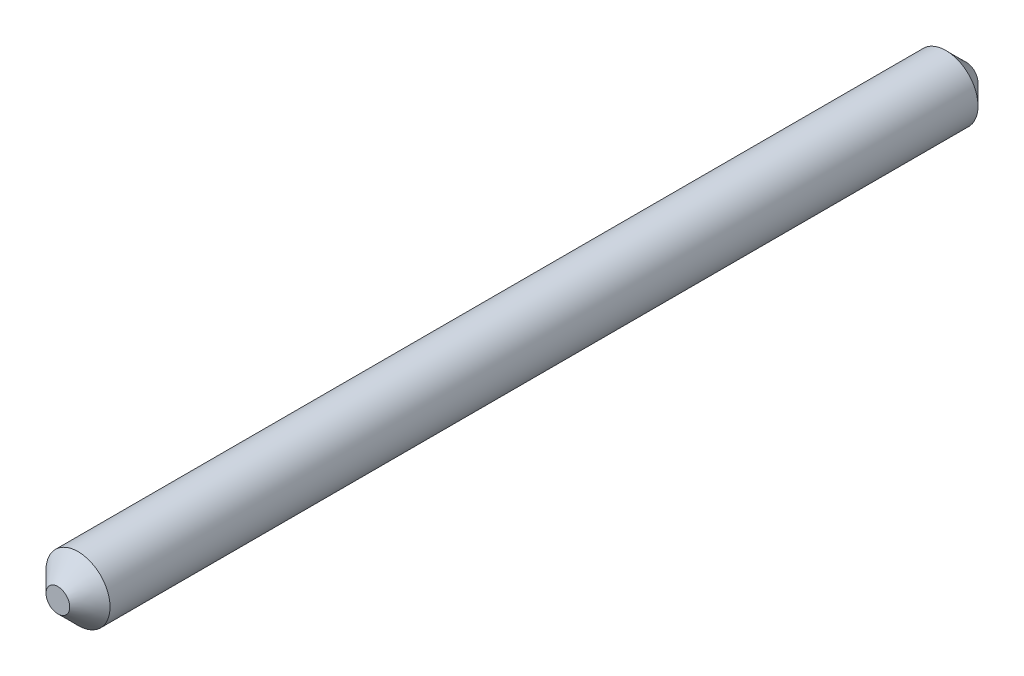
ISO-10303-21;
HEADER;
FILE_DESCRIPTION(('STEP AP214'),'2;1');
FILE_NAME('part.step','',(''),(''),'','','');
FILE_SCHEMA(('AUTOMOTIVE_DESIGN { 1 0 10303 214 1 1 1 1 }'));
ENDSEC;
DATA;
#1=APPLICATION_CONTEXT('core data for automotive mechanical design processes');
#2=APPLICATION_PROTOCOL_DEFINITION('international standard','automotive_design',2000,#1);
#3=PRODUCT_CONTEXT('',#1,'mechanical');
#4=PRODUCT('Part','Part','',(#3));
#5=PRODUCT_RELATED_PRODUCT_CATEGORY('part','',(#4));
#6=PRODUCT_DEFINITION_FORMATION('','',#4);
#7=PRODUCT_DEFINITION_CONTEXT('part definition',#1,'design');
#8=PRODUCT_DEFINITION('design','',#6,#7);
#9=PRODUCT_DEFINITION_SHAPE('','',#8);
#10=(LENGTH_UNIT() NAMED_UNIT(*) SI_UNIT(.MILLI.,.METRE.));
#11=(NAMED_UNIT(*) PLANE_ANGLE_UNIT() SI_UNIT($,.RADIAN.));
#12=(NAMED_UNIT(*) SI_UNIT($,.STERADIAN.) SOLID_ANGLE_UNIT());
#13=UNCERTAINTY_MEASURE_WITH_UNIT(LENGTH_MEASURE(1.E-05),#10,'distance_accuracy_value','');
#14=(GEOMETRIC_REPRESENTATION_CONTEXT(3) GLOBAL_UNCERTAINTY_ASSIGNED_CONTEXT((#13)) GLOBAL_UNIT_ASSIGNED_CONTEXT((#10,
#11,#12)) REPRESENTATION_CONTEXT('',''));
#15=CARTESIAN_POINT('',(0.,0.,0.));
#16=DIRECTION('',(0.,0.,1.));
#17=DIRECTION('',(1.,0.,0.));
#18=AXIS2_PLACEMENT_3D('',#15,#16,#17);
#19=CARTESIAN_POINT('',(0.,0.,22.5));
#20=DIRECTION('',(0.,0.,-1.));
#21=DIRECTION('',(-1.,0.,0.));
#22=AXIS2_PLACEMENT_3D('',#19,#20,#21);
#23=CYLINDRICAL_SURFACE('',#22,1.5875);
#24=CARTESIAN_POINT('',(0.,0.,21.5));
#25=DIRECTION('',(0.,0.,1.));
#26=DIRECTION('',(1.,0.,0.));
#27=AXIS2_PLACEMENT_3D('',#24,#25,#26);
#28=CIRCLE('',#27,1.5875);
#29=CARTESIAN_POINT('',(-1.5875,0.,21.5));
#30=VERTEX_POINT('',#29);
#31=EDGE_CURVE('E39',#30,#30,#28,.F.);
#32=CARTESIAN_POINT('',(0.,0.,-21.5));
#33=DIRECTION('',(0.,0.,1.));
#34=DIRECTION('',(1.,0.,0.));
#35=AXIS2_PLACEMENT_3D('',#32,#33,#34);
#36=CIRCLE('',#35,1.5875);
#37=CARTESIAN_POINT('',(-1.5875,0.,-21.5));
#38=VERTEX_POINT('',#37);
#39=EDGE_CURVE('E43',#38,#38,#36,.T.);
#40=CARTESIAN_POINT('',(-1.5875,0.,21.5));
#41=CARTESIAN_POINT('',(-1.5875,0.,21.0520833333334));
#42=CARTESIAN_POINT('',(-1.5875,0.,20.6041666666667));
#43=CARTESIAN_POINT('',(-1.5875,0.,19.7083333333334));
#44=CARTESIAN_POINT('',(-1.5875,0.,19.2604166666667));
#45=CARTESIAN_POINT('',(-1.5875,0.,18.3645833333334));
#46=CARTESIAN_POINT('',(-1.5875,0.,17.9166666666667));
#47=CARTESIAN_POINT('',(-1.5875,0.,17.0208333333334));
#48=CARTESIAN_POINT('',(-1.5875,0.,16.5729166666667));
#49=CARTESIAN_POINT('',(-1.5875,0.,15.6770833333334));
#50=CARTESIAN_POINT('',(-1.5875,0.,15.2291666666667));
#51=CARTESIAN_POINT('',(-1.5875,0.,14.3333333333334));
#52=CARTESIAN_POINT('',(-1.5875,0.,13.8854166666667));
#53=CARTESIAN_POINT('',(-1.5875,0.,12.9895833333334));
#54=CARTESIAN_POINT('',(-1.5875,0.,12.5416666666667));
#55=CARTESIAN_POINT('',(-1.5875,0.,11.6458333333334));
#56=CARTESIAN_POINT('',(-1.5875,0.,11.1979166666667));
#57=CARTESIAN_POINT('',(-1.5875,0.,10.3020833333334));
#58=CARTESIAN_POINT('',(-1.5875,0.,9.85416666666669));
#59=CARTESIAN_POINT('',(-1.5875,0.,8.95833333333336));
#60=CARTESIAN_POINT('',(-1.5875,0.,8.51041666666669));
#61=CARTESIAN_POINT('',(-1.5875,0.,7.61458333333336));
#62=CARTESIAN_POINT('',(-1.5875,0.,7.16666666666669));
#63=CARTESIAN_POINT('',(-1.5875,0.,6.27083333333336));
#64=CARTESIAN_POINT('',(-1.5875,0.,5.82291666666669));
#65=CARTESIAN_POINT('',(-1.5875,0.,4.92708333333336));
#66=CARTESIAN_POINT('',(-1.5875,0.,4.47916666666669));
#67=CARTESIAN_POINT('',(-1.5875,0.,3.58333333333336));
#68=CARTESIAN_POINT('',(-1.5875,0.,3.13541666666669));
#69=CARTESIAN_POINT('',(-1.5875,0.,2.23958333333336));
#70=CARTESIAN_POINT('',(-1.5875,0.,1.79166666666669));
#71=CARTESIAN_POINT('',(-1.5875,0.,0.895833333333355));
#72=CARTESIAN_POINT('',(-1.5875,0.,0.447916666666688));
#73=CARTESIAN_POINT('',(-1.5875,0.,-0.447916666666646));
#74=CARTESIAN_POINT('',(-1.5875,0.,-0.895833333333313));
#75=CARTESIAN_POINT('',(-1.5875,0.,-1.79166666666665));
#76=CARTESIAN_POINT('',(-1.5875,0.,-2.23958333333331));
#77=CARTESIAN_POINT('',(-1.5875,0.,-3.13541666666665));
#78=CARTESIAN_POINT('',(-1.5875,0.,-3.58333333333331));
#79=CARTESIAN_POINT('',(-1.5875,0.,-4.47916666666665));
#80=CARTESIAN_POINT('',(-1.5875,0.,-4.92708333333331));
#81=CARTESIAN_POINT('',(-1.5875,0.,-5.82291666666665));
#82=CARTESIAN_POINT('',(-1.5875,0.,-6.27083333333332));
#83=CARTESIAN_POINT('',(-1.5875,0.,-7.16666666666665));
#84=CARTESIAN_POINT('',(-1.5875,0.,-7.61458333333331));
#85=CARTESIAN_POINT('',(-1.5875,0.,-8.51041666666664));
#86=CARTESIAN_POINT('',(-1.5875,0.,-8.95833333333331));
#87=CARTESIAN_POINT('',(-1.5875,0.,-9.85416666666664));
#88=CARTESIAN_POINT('',(-1.5875,0.,-10.3020833333333));
#89=CARTESIAN_POINT('',(-1.5875,0.,-11.1979166666666));
#90=CARTESIAN_POINT('',(-1.5875,0.,-11.6458333333333));
#91=CARTESIAN_POINT('',(-1.5875,0.,-12.5416666666666));
#92=CARTESIAN_POINT('',(-1.5875,0.,-12.9895833333333));
#93=CARTESIAN_POINT('',(-1.5875,0.,-13.8854166666666));
#94=CARTESIAN_POINT('',(-1.5875,0.,-14.3333333333333));
#95=CARTESIAN_POINT('',(-1.5875,0.,-15.2291666666666));
#96=CARTESIAN_POINT('',(-1.5875,0.,-15.6770833333333));
#97=CARTESIAN_POINT('',(-1.5875,0.,-16.5729166666666));
#98=CARTESIAN_POINT('',(-1.5875,0.,-17.0208333333333));
#99=CARTESIAN_POINT('',(-1.5875,0.,-17.9166666666666));
#100=CARTESIAN_POINT('',(-1.5875,0.,-18.3645833333333));
#101=CARTESIAN_POINT('',(-1.5875,0.,-19.2604166666666));
#102=CARTESIAN_POINT('',(-1.5875,0.,-19.7083333333333));
#103=CARTESIAN_POINT('',(-1.5875,0.,-20.6041666666666));
#104=CARTESIAN_POINT('',(-1.5875,0.,-21.0520833333333));
#105=CARTESIAN_POINT('',(-1.5875,0.,-21.5));
#106=B_SPLINE_CURVE_WITH_KNOTS('',3,(#40,#41,#42,#43,#44,#45,#46,#47,#48,#49,#50,#51,#52,#53,
#54,#55,#56,#57,#58,#59,#60,#61,#62,#63,#64,#65,#66,#67,#68,#69,#70,#71,#72,#73,#74,#75,#76,#77,
#78,#79,#80,#81,#82,#83,#84,#85,#86,#87,#88,#89,#90,#91,#92,#93,#94,#95,#96,#97,#98,#99,#100,
#101,#102,#103,#104,#105),.UNSPECIFIED.,.F.,.F.,(4,2,2,2,2,2,2,2,2,2,2,2,2,2,2,2,2,2,2,2,2,2,2,
2,2,2,2,2,2,2,2,2,4),(0.,1.34375,2.6875,4.03125,5.375,6.71875,8.0625,9.40625,10.75,12.09375,
13.4375,14.78125,16.125,17.46875,18.8125,20.15625,21.5,22.84375,24.1875,25.53125,26.875,
28.21875,29.5625,30.90625,32.25,33.59375,34.9375,36.28125,37.625,38.96875,40.3125,41.65625,43.),.UNSPECIFIED.);
#107=EDGE_CURVE('BSEAM32',#30,#38,#106,.T.);
#108=ORIENTED_EDGE('',*,*,#31,.T.);
#109=ORIENTED_EDGE('',*,*,#39,.T.);
#110=ORIENTED_EDGE('',*,*,#107,.T.);
#111=ORIENTED_EDGE('',*,*,#107,.F.);
#112=EDGE_LOOP('',(#108,#110,#109,#111));
#113=FACE_BOUND('',#112,.T.);
#114=ADVANCED_FACE('F32',(#113),#23,.T.);
#115=CARTESIAN_POINT('',(0.,0.,22.5));
#116=DIRECTION('',(0.,0.,1.));
#117=DIRECTION('',(1.,0.,0.));
#118=AXIS2_PLACEMENT_3D('',#115,#116,#117);
#119=PLANE('',#118);
#120=CARTESIAN_POINT('',(0.,0.,22.5));
#121=DIRECTION('',(0.,0.,1.));
#122=DIRECTION('',(1.,0.,0.));
#123=AXIS2_PLACEMENT_3D('',#120,#121,#122);
#124=CIRCLE('',#123,0.587500000000025);
#125=CARTESIAN_POINT('',(0.587500000000025,0.,22.5));
#126=VERTEX_POINT('',#125);
#127=EDGE_CURVE('E47',#126,#126,#124,.T.);
#128=ORIENTED_EDGE('',*,*,#127,.T.);
#129=EDGE_LOOP('',(#128));
#130=FACE_BOUND('',#129,.T.);
#131=ADVANCED_FACE('F53',(#130),#119,.T.);
#132=CARTESIAN_POINT('',(0.,0.,-22.5));
#133=DIRECTION('',(0.,0.,1.));
#134=DIRECTION('',(1.,0.,0.));
#135=AXIS2_PLACEMENT_3D('',#132,#133,#134);
#136=PLANE('',#135);
#137=CARTESIAN_POINT('',(0.,0.,-22.5));
#138=DIRECTION('',(0.,0.,1.));
#139=DIRECTION('',(1.,0.,0.));
#140=AXIS2_PLACEMENT_3D('',#137,#138,#139);
#141=CIRCLE('',#140,0.587499999999956);
#142=CARTESIAN_POINT('',(0.587499999999956,0.,-22.5));
#143=VERTEX_POINT('',#142);
#144=EDGE_CURVE('E10',#143,#143,#141,.F.);
#145=ORIENTED_EDGE('',*,*,#144,.T.);
#146=EDGE_LOOP('',(#145));
#147=FACE_BOUND('',#146,.T.);
#148=ADVANCED_FACE('F57',(#147),#136,.F.);
#149=CARTESIAN_POINT('',(0.,0.,22.5));
#150=DIRECTION('',(0.,0.,-1.));
#151=DIRECTION('',(-1.,0.,0.));
#152=AXIS2_PLACEMENT_3D('',#149,#150,#151);
#153=CONICAL_SURFACE('',#152,0.587500000000025,0.785398163397449);
#154=ORIENTED_EDGE('',*,*,#31,.F.);
#155=EDGE_LOOP('',(#154));
#156=FACE_BOUND('',#155,.T.);
#157=ORIENTED_EDGE('',*,*,#127,.F.);
#158=EDGE_LOOP('',(#157));
#159=FACE_BOUND('',#158,.T.);
#160=ADVANCED_FACE('F55',(#156,#159),#153,.T.);
#161=CARTESIAN_POINT('',(0.,0.,-21.5));
#162=DIRECTION('',(0.,0.,1.));
#163=DIRECTION('',(1.,0.,0.));
#164=AXIS2_PLACEMENT_3D('',#161,#162,#163);
#165=CONICAL_SURFACE('',#164,1.5875,0.785398163397456);
#166=ORIENTED_EDGE('',*,*,#144,.F.);
#167=EDGE_LOOP('',(#166));
#168=FACE_BOUND('',#167,.T.);
#169=ORIENTED_EDGE('',*,*,#39,.F.);
#170=EDGE_LOOP('',(#169));
#171=FACE_BOUND('',#170,.T.);
#172=ADVANCED_FACE('F34',(#168,#171),#165,.T.);
#173=CLOSED_SHELL('',(#114,#131,#148,#160,#172));
#174=MANIFOLD_SOLID_BREP('B2',#173);
#175=ADVANCED_BREP_SHAPE_REPRESENTATION('',(#18,#174),#14);
#176=SHAPE_DEFINITION_REPRESENTATION(#9,#175);
ENDSEC;
END-ISO-10303-21;
